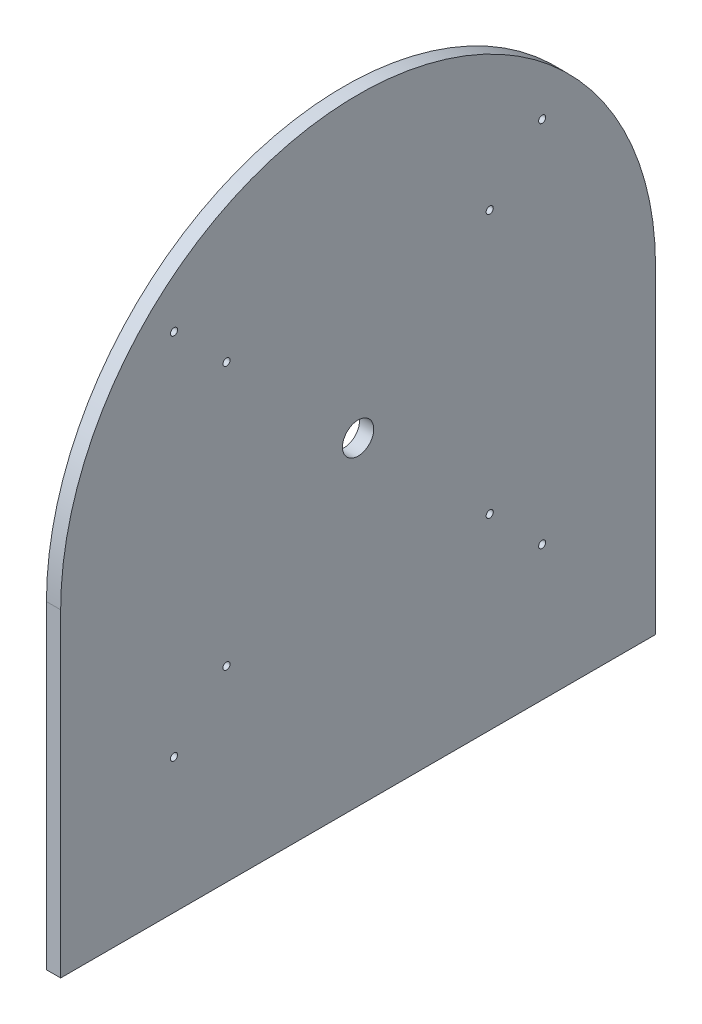
ISO-10303-21;
HEADER;
FILE_DESCRIPTION(('STEP AP214'),'2;1');
FILE_NAME('part.step','',(''),(''),'','','');
FILE_SCHEMA(('AUTOMOTIVE_DESIGN { 1 0 10303 214 1 1 1 1 }'));
ENDSEC;
DATA;
#1=APPLICATION_CONTEXT('core data for automotive mechanical design processes');
#2=APPLICATION_PROTOCOL_DEFINITION('international standard','automotive_design',2000,#1);
#3=PRODUCT_CONTEXT('',#1,'mechanical');
#4=PRODUCT('Part','Part','',(#3));
#5=PRODUCT_RELATED_PRODUCT_CATEGORY('part','',(#4));
#6=PRODUCT_DEFINITION_FORMATION('','',#4);
#7=PRODUCT_DEFINITION_CONTEXT('part definition',#1,'design');
#8=PRODUCT_DEFINITION('design','',#6,#7);
#9=PRODUCT_DEFINITION_SHAPE('','',#8);
#10=(LENGTH_UNIT() NAMED_UNIT(*) SI_UNIT(.MILLI.,.METRE.));
#11=(NAMED_UNIT(*) PLANE_ANGLE_UNIT() SI_UNIT($,.RADIAN.));
#12=(NAMED_UNIT(*) SI_UNIT($,.STERADIAN.) SOLID_ANGLE_UNIT());
#13=UNCERTAINTY_MEASURE_WITH_UNIT(LENGTH_MEASURE(1.E-05),#10,'distance_accuracy_value','');
#14=(GEOMETRIC_REPRESENTATION_CONTEXT(3) GLOBAL_UNCERTAINTY_ASSIGNED_CONTEXT((#13)) GLOBAL_UNIT_ASSIGNED_CONTEXT((#10,
#11,#12)) REPRESENTATION_CONTEXT('',''));
#15=CARTESIAN_POINT('',(0.,0.,0.));
#16=DIRECTION('',(0.,0.,1.));
#17=DIRECTION('',(1.,0.,0.));
#18=AXIS2_PLACEMENT_3D('',#15,#16,#17);
#19=CARTESIAN_POINT('',(10.,0.,0.));
#20=DIRECTION('',(-1.,0.,0.));
#21=DIRECTION('',(0.,0.,1.));
#22=AXIS2_PLACEMENT_3D('',#19,#20,#21);
#23=CYLINDRICAL_SURFACE('',#22,209.31);
#24=CARTESIAN_POINT('',(0.,0.,0.));
#25=DIRECTION('',(1.,0.,0.));
#26=DIRECTION('',(0.,0.,-1.));
#27=AXIS2_PLACEMENT_3D('',#24,#25,#26);
#28=CIRCLE('',#27,209.31);
#29=CARTESIAN_POINT('',(0.,0.,-209.31));
#30=VERTEX_POINT('',#29);
#31=CARTESIAN_POINT('',(0.,0.,209.31));
#32=VERTEX_POINT('',#31);
#33=EDGE_CURVE('E108',#30,#32,#28,.T.);
#34=ORIENTED_EDGE('',*,*,#33,.T.);
#35=DIRECTION('',(-1.,0.,0.));
#36=VECTOR('',#35,1.);
#37=CARTESIAN_POINT('',(10.,0.,209.31));
#38=LINE('',#37,#36);
#39=CARTESIAN_POINT('',(10.,0.,209.31));
#40=VERTEX_POINT('',#39);
#41=EDGE_CURVE('E11',#40,#32,#38,.T.);
#42=ORIENTED_EDGE('',*,*,#41,.F.);
#43=CARTESIAN_POINT('',(10.,0.,0.));
#44=DIRECTION('',(1.,0.,0.));
#45=DIRECTION('',(0.,0.,-1.));
#46=AXIS2_PLACEMENT_3D('',#43,#44,#45);
#47=CIRCLE('',#46,209.31);
#48=CARTESIAN_POINT('',(10.,0.,-209.31));
#49=VERTEX_POINT('',#48);
#50=EDGE_CURVE('E81',#49,#40,#47,.T.);
#51=ORIENTED_EDGE('',*,*,#50,.F.);
#52=DIRECTION('',(-1.,0.,0.));
#53=VECTOR('',#52,1.);
#54=CARTESIAN_POINT('',(10.,0.,-209.31));
#55=LINE('',#54,#53);
#56=EDGE_CURVE('E104',#49,#30,#55,.T.);
#57=ORIENTED_EDGE('',*,*,#56,.T.);
#58=EDGE_LOOP('',(#34,#42,#51,#57));
#59=FACE_BOUND('',#58,.T.);
#60=ADVANCED_FACE('F41',(#59),#23,.T.);
#61=CARTESIAN_POINT('',(10.,0.,209.31));
#62=DIRECTION('',(0.,0.,1.));
#63=DIRECTION('',(0.,-1.,0.));
#64=AXIS2_PLACEMENT_3D('',#61,#62,#63);
#65=PLANE('',#64);
#66=DIRECTION('',(0.,1.,0.));
#67=VECTOR('',#66,1.);
#68=CARTESIAN_POINT('',(0.,0.,209.31));
#69=LINE('',#68,#67);
#70=CARTESIAN_POINT('',(0.,-224.4,209.31));
#71=VERTEX_POINT('',#70);
#72=EDGE_CURVE('E90',#71,#32,#69,.T.);
#73=ORIENTED_EDGE('',*,*,#72,.F.);
#74=DIRECTION('',(-1.,0.,0.));
#75=VECTOR('',#74,1.);
#76=CARTESIAN_POINT('',(10.,-224.4,209.31));
#77=LINE('',#76,#75);
#78=CARTESIAN_POINT('',(10.,-224.4,209.31));
#79=VERTEX_POINT('',#78);
#80=EDGE_CURVE('E50',#79,#71,#77,.T.);
#81=ORIENTED_EDGE('',*,*,#80,.F.);
#82=DIRECTION('',(0.,1.,0.));
#83=VECTOR('',#82,1.);
#84=CARTESIAN_POINT('',(10.,0.,209.31));
#85=LINE('',#84,#83);
#86=EDGE_CURVE('E88',#79,#40,#85,.T.);
#87=ORIENTED_EDGE('',*,*,#86,.T.);
#88=ORIENTED_EDGE('',*,*,#41,.T.);
#89=EDGE_LOOP('',(#73,#81,#87,#88));
#90=FACE_BOUND('',#89,.T.);
#91=ADVANCED_FACE('F87',(#90),#65,.T.);
#92=CARTESIAN_POINT('',(10.,-224.4,0.));
#93=DIRECTION('',(0.,-1.,0.));
#94=DIRECTION('',(0.,0.,-1.));
#95=AXIS2_PLACEMENT_3D('',#92,#93,#94);
#96=PLANE('',#95);
#97=DIRECTION('',(0.,0.,1.));
#98=VECTOR('',#97,1.);
#99=CARTESIAN_POINT('',(0.,-224.4,0.));
#100=LINE('',#99,#98);
#101=CARTESIAN_POINT('',(0.,-224.4,-209.31));
#102=VERTEX_POINT('',#101);
#103=EDGE_CURVE('E115',#102,#71,#100,.T.);
#104=ORIENTED_EDGE('',*,*,#103,.F.);
#105=DIRECTION('',(-1.,0.,0.));
#106=VECTOR('',#105,1.);
#107=CARTESIAN_POINT('',(10.,-224.4,-209.31));
#108=LINE('',#107,#106);
#109=CARTESIAN_POINT('',(10.,-224.4,-209.31));
#110=VERTEX_POINT('',#109);
#111=EDGE_CURVE('E73',#110,#102,#108,.T.);
#112=ORIENTED_EDGE('',*,*,#111,.F.);
#113=DIRECTION('',(0.,0.,1.));
#114=VECTOR('',#113,1.);
#115=CARTESIAN_POINT('',(10.,-224.4,0.));
#116=LINE('',#115,#114);
#117=EDGE_CURVE('E97',#110,#79,#116,.T.);
#118=ORIENTED_EDGE('',*,*,#117,.T.);
#119=ORIENTED_EDGE('',*,*,#80,.T.);
#120=EDGE_LOOP('',(#104,#112,#118,#119));
#121=FACE_BOUND('',#120,.T.);
#122=ADVANCED_FACE('F100',(#121),#96,.T.);
#123=CARTESIAN_POINT('',(10.,0.,-209.31));
#124=DIRECTION('',(0.,0.,1.));
#125=DIRECTION('',(1.,0.,0.));
#126=AXIS2_PLACEMENT_3D('',#123,#124,#125);
#127=PLANE('',#126);
#128=DIRECTION('',(0.,1.,0.));
#129=VECTOR('',#128,1.);
#130=CARTESIAN_POINT('',(0.,0.,-209.31));
#131=LINE('',#130,#129);
#132=EDGE_CURVE('E76',#102,#30,#131,.T.);
#133=ORIENTED_EDGE('',*,*,#132,.T.);
#134=ORIENTED_EDGE('',*,*,#56,.F.);
#135=DIRECTION('',(0.,1.,0.));
#136=VECTOR('',#135,1.);
#137=CARTESIAN_POINT('',(10.,0.,-209.31));
#138=LINE('',#137,#136);
#139=EDGE_CURVE('E58',#110,#49,#138,.T.);
#140=ORIENTED_EDGE('',*,*,#139,.F.);
#141=ORIENTED_EDGE('',*,*,#111,.T.);
#142=EDGE_LOOP('',(#133,#134,#140,#141));
#143=FACE_BOUND('',#142,.T.);
#144=ADVANCED_FACE('F138',(#143),#127,.F.);
#145=CARTESIAN_POINT('',(10.,0.,0.));
#146=DIRECTION('',(1.,0.,0.));
#147=DIRECTION('',(0.,0.,-1.));
#148=AXIS2_PLACEMENT_3D('',#145,#146,#147);
#149=PLANE('',#148);
#150=CARTESIAN_POINT('',(10.,0.,0.));
#151=DIRECTION('',(1.,0.,0.));
#152=DIRECTION('',(0.,0.,-1.));
#153=AXIS2_PLACEMENT_3D('',#150,#151,#152);
#154=CIRCLE('',#153,11.);
#155=CARTESIAN_POINT('',(10.,0.,-11.));
#156=VERTEX_POINT('',#155);
#157=EDGE_CURVE('E328',#156,#156,#154,.T.);
#158=ORIENTED_EDGE('',*,*,#157,.F.);
#159=EDGE_LOOP('',(#158));
#160=FACE_BOUND('',#159,.T.);
#161=CARTESIAN_POINT('',(10.,-92.6097751320016,-92.6097751320129));
#162=DIRECTION('',(1.,0.,0.));
#163=DIRECTION('',(0.,0.,-1.));
#164=AXIS2_PLACEMENT_3D('',#161,#162,#163);
#165=CIRCLE('',#164,2.49999999999715);
#166=CARTESIAN_POINT('',(10.,-92.6097751320016,-95.1097751320101));
#167=VERTEX_POINT('',#166);
#168=EDGE_CURVE('E276',#167,#167,#165,.T.);
#169=ORIENTED_EDGE('',*,*,#168,.F.);
#170=EDGE_LOOP('',(#169));
#171=FACE_BOUND('',#170,.T.);
#172=CARTESIAN_POINT('',(10.,92.6097751320026,-92.6097751320016));
#173=DIRECTION('',(1.,0.,0.));
#174=DIRECTION('',(0.,0.,-1.));
#175=AXIS2_PLACEMENT_3D('',#172,#173,#174);
#176=CIRCLE('',#175,2.5);
#177=CARTESIAN_POINT('',(10.,92.6097751320026,-95.1097751320016));
#178=VERTEX_POINT('',#177);
#179=EDGE_CURVE('E285',#178,#178,#176,.T.);
#180=ORIENTED_EDGE('',*,*,#179,.F.);
#181=EDGE_LOOP('',(#180));
#182=FACE_BOUND('',#181,.T.);
#183=CARTESIAN_POINT('',(10.,129.534891245564,-129.534891245563));
#184=DIRECTION('',(1.,0.,0.));
#185=DIRECTION('',(0.,0.,-1.));
#186=AXIS2_PLACEMENT_3D('',#183,#184,#185);
#187=CIRCLE('',#186,2.5);
#188=CARTESIAN_POINT('',(10.,129.534891245564,-132.034891245563));
#189=VERTEX_POINT('',#188);
#190=EDGE_CURVE('E293',#189,#189,#187,.T.);
#191=ORIENTED_EDGE('',*,*,#190,.F.);
#192=EDGE_LOOP('',(#191));
#193=FACE_BOUND('',#192,.T.);
#194=CARTESIAN_POINT('',(10.,129.534891245553,129.534891245564));
#195=DIRECTION('',(1.,0.,0.));
#196=DIRECTION('',(0.,0.,-1.));
#197=AXIS2_PLACEMENT_3D('',#194,#195,#196);
#198=CIRCLE('',#197,2.50000000001075);
#199=CARTESIAN_POINT('',(10.,129.534891245553,127.034891245554));
#200=VERTEX_POINT('',#199);
#201=EDGE_CURVE('E301',#200,#200,#198,.T.);
#202=ORIENTED_EDGE('',*,*,#201,.F.);
#203=EDGE_LOOP('',(#202));
#204=FACE_BOUND('',#203,.T.);
#205=CARTESIAN_POINT('',(10.,92.6097751319913,92.6097751320027));
#206=DIRECTION('',(1.,0.,0.));
#207=DIRECTION('',(0.,0.,-1.));
#208=AXIS2_PLACEMENT_3D('',#205,#206,#207);
#209=CIRCLE('',#208,2.50000000001048);
#210=CARTESIAN_POINT('',(10.,92.6097751319913,90.1097751319922));
#211=VERTEX_POINT('',#210);
#212=EDGE_CURVE('E309',#211,#211,#209,.T.);
#213=ORIENTED_EDGE('',*,*,#212,.F.);
#214=EDGE_LOOP('',(#213));
#215=FACE_BOUND('',#214,.T.);
#216=CARTESIAN_POINT('',(10.,-129.534891245575,129.534891245553));
#217=DIRECTION('',(1.,0.,0.));
#218=DIRECTION('',(0.,0.,-1.));
#219=AXIS2_PLACEMENT_3D('',#216,#217,#218);
#220=CIRCLE('',#219,2.50000000000739);
#221=CARTESIAN_POINT('',(10.,-129.534891245575,127.034891245545));
#222=VERTEX_POINT('',#221);
#223=EDGE_CURVE('E270',#222,#222,#220,.T.);
#224=ORIENTED_EDGE('',*,*,#223,.F.);
#225=EDGE_LOOP('',(#224));
#226=FACE_BOUND('',#225,.T.);
#227=CARTESIAN_POINT('',(10.,-129.534891245563,-129.534891245575));
#228=DIRECTION('',(1.,0.,0.));
#229=DIRECTION('',(0.,0.,-1.));
#230=AXIS2_PLACEMENT_3D('',#227,#228,#229);
#231=CIRCLE('',#230,2.49999999999725);
#232=CARTESIAN_POINT('',(10.,-129.534891245563,-132.034891245572));
#233=VERTEX_POINT('',#232);
#234=EDGE_CURVE('E262',#233,#233,#231,.T.);
#235=ORIENTED_EDGE('',*,*,#234,.F.);
#236=EDGE_LOOP('',(#235));
#237=FACE_BOUND('',#236,.T.);
#238=CARTESIAN_POINT('',(10.,-92.609775132013,92.6097751319913));
#239=DIRECTION('',(1.,0.,0.));
#240=DIRECTION('',(0.,0.,-1.));
#241=AXIS2_PLACEMENT_3D('',#238,#239,#240);
#242=CIRCLE('',#241,2.5000000000072);
#243=CARTESIAN_POINT('',(10.,-92.609775132013,90.1097751319841));
#244=VERTEX_POINT('',#243);
#245=EDGE_CURVE('E280',#244,#244,#242,.T.);
#246=ORIENTED_EDGE('',*,*,#245,.F.);
#247=EDGE_LOOP('',(#246));
#248=FACE_BOUND('',#247,.T.);
#249=ORIENTED_EDGE('',*,*,#50,.T.);
#250=ORIENTED_EDGE('',*,*,#86,.F.);
#251=ORIENTED_EDGE('',*,*,#117,.F.);
#252=ORIENTED_EDGE('',*,*,#139,.T.);
#253=EDGE_LOOP('',(#249,#250,#251,#252));
#254=FACE_BOUND('',#253,.T.);
#255=ADVANCED_FACE('F96',(#160,#171,#182,#193,#204,#215,#226,#237,#248,#254),#149,.T.);
#256=CARTESIAN_POINT('',(0.,0.,0.));
#257=DIRECTION('',(1.,0.,0.));
#258=DIRECTION('',(0.,0.,-1.));
#259=AXIS2_PLACEMENT_3D('',#256,#257,#258);
#260=PLANE('',#259);
#261=CARTESIAN_POINT('',(0.,0.,0.));
#262=DIRECTION('',(1.,0.,0.));
#263=DIRECTION('',(0.,0.,-1.));
#264=AXIS2_PLACEMENT_3D('',#261,#262,#263);
#265=CIRCLE('',#264,11.);
#266=CARTESIAN_POINT('',(0.,0.,-11.));
#267=VERTEX_POINT('',#266);
#268=EDGE_CURVE('E272',#267,#267,#265,.T.);
#269=ORIENTED_EDGE('',*,*,#268,.T.);
#270=EDGE_LOOP('',(#269));
#271=FACE_BOUND('',#270,.T.);
#272=CARTESIAN_POINT('',(0.,-92.6097751320016,-92.6097751320129));
#273=DIRECTION('',(1.,0.,0.));
#274=DIRECTION('',(0.,0.,-1.));
#275=AXIS2_PLACEMENT_3D('',#272,#273,#274);
#276=CIRCLE('',#275,2.49999999999715);
#277=CARTESIAN_POINT('',(0.,-92.6097751320016,-95.1097751320101));
#278=VERTEX_POINT('',#277);
#279=EDGE_CURVE('E281',#278,#278,#276,.T.);
#280=ORIENTED_EDGE('',*,*,#279,.T.);
#281=EDGE_LOOP('',(#280));
#282=FACE_BOUND('',#281,.T.);
#283=CARTESIAN_POINT('',(0.,92.6097751320026,-92.6097751320016));
#284=DIRECTION('',(1.,0.,0.));
#285=DIRECTION('',(0.,0.,-1.));
#286=AXIS2_PLACEMENT_3D('',#283,#284,#285);
#287=CIRCLE('',#286,2.5);
#288=CARTESIAN_POINT('',(0.,92.6097751320026,-95.1097751320016));
#289=VERTEX_POINT('',#288);
#290=EDGE_CURVE('E289',#289,#289,#287,.T.);
#291=ORIENTED_EDGE('',*,*,#290,.T.);
#292=EDGE_LOOP('',(#291));
#293=FACE_BOUND('',#292,.T.);
#294=CARTESIAN_POINT('',(0.,129.534891245564,-129.534891245563));
#295=DIRECTION('',(1.,0.,0.));
#296=DIRECTION('',(0.,0.,-1.));
#297=AXIS2_PLACEMENT_3D('',#294,#295,#296);
#298=CIRCLE('',#297,2.5);
#299=CARTESIAN_POINT('',(0.,129.534891245564,-132.034891245563));
#300=VERTEX_POINT('',#299);
#301=EDGE_CURVE('E297',#300,#300,#298,.T.);
#302=ORIENTED_EDGE('',*,*,#301,.T.);
#303=EDGE_LOOP('',(#302));
#304=FACE_BOUND('',#303,.T.);
#305=CARTESIAN_POINT('',(0.,129.534891245553,129.534891245564));
#306=DIRECTION('',(1.,0.,0.));
#307=DIRECTION('',(0.,0.,-1.));
#308=AXIS2_PLACEMENT_3D('',#305,#306,#307);
#309=CIRCLE('',#308,2.50000000001075);
#310=CARTESIAN_POINT('',(0.,129.534891245553,127.034891245554));
#311=VERTEX_POINT('',#310);
#312=EDGE_CURVE('E305',#311,#311,#309,.T.);
#313=ORIENTED_EDGE('',*,*,#312,.T.);
#314=EDGE_LOOP('',(#313));
#315=FACE_BOUND('',#314,.T.);
#316=CARTESIAN_POINT('',(0.,92.6097751319913,92.6097751320027));
#317=DIRECTION('',(1.,0.,0.));
#318=DIRECTION('',(0.,0.,-1.));
#319=AXIS2_PLACEMENT_3D('',#316,#317,#318);
#320=CIRCLE('',#319,2.50000000001048);
#321=CARTESIAN_POINT('',(0.,92.6097751319913,90.1097751319922));
#322=VERTEX_POINT('',#321);
#323=EDGE_CURVE('E319',#322,#322,#320,.T.);
#324=ORIENTED_EDGE('',*,*,#323,.T.);
#325=EDGE_LOOP('',(#324));
#326=FACE_BOUND('',#325,.T.);
#327=CARTESIAN_POINT('',(0.,-129.534891245575,129.534891245553));
#328=DIRECTION('',(1.,0.,0.));
#329=DIRECTION('',(0.,0.,-1.));
#330=AXIS2_PLACEMENT_3D('',#327,#328,#329);
#331=CIRCLE('',#330,2.50000000000739);
#332=CARTESIAN_POINT('',(0.,-129.534891245575,127.034891245545));
#333=VERTEX_POINT('',#332);
#334=EDGE_CURVE('E265',#333,#333,#331,.T.);
#335=ORIENTED_EDGE('',*,*,#334,.T.);
#336=EDGE_LOOP('',(#335));
#337=FACE_BOUND('',#336,.T.);
#338=CARTESIAN_POINT('',(0.,-129.534891245563,-129.534891245575));
#339=DIRECTION('',(1.,0.,0.));
#340=DIRECTION('',(0.,0.,-1.));
#341=AXIS2_PLACEMENT_3D('',#338,#339,#340);
#342=CIRCLE('',#341,2.49999999999725);
#343=CARTESIAN_POINT('',(0.,-129.534891245563,-132.034891245572));
#344=VERTEX_POINT('',#343);
#345=EDGE_CURVE('E259',#344,#344,#342,.T.);
#346=ORIENTED_EDGE('',*,*,#345,.T.);
#347=EDGE_LOOP('',(#346));
#348=FACE_BOUND('',#347,.T.);
#349=CARTESIAN_POINT('',(0.,-92.609775132013,92.6097751319913));
#350=DIRECTION('',(1.,0.,0.));
#351=DIRECTION('',(0.,0.,-1.));
#352=AXIS2_PLACEMENT_3D('',#349,#350,#351);
#353=CIRCLE('',#352,2.5000000000072);
#354=CARTESIAN_POINT('',(0.,-92.609775132013,90.1097751319841));
#355=VERTEX_POINT('',#354);
#356=EDGE_CURVE('E112',#355,#355,#353,.T.);
#357=ORIENTED_EDGE('',*,*,#356,.T.);
#358=EDGE_LOOP('',(#357));
#359=FACE_BOUND('',#358,.T.);
#360=ORIENTED_EDGE('',*,*,#33,.F.);
#361=ORIENTED_EDGE('',*,*,#132,.F.);
#362=ORIENTED_EDGE('',*,*,#103,.T.);
#363=ORIENTED_EDGE('',*,*,#72,.T.);
#364=EDGE_LOOP('',(#360,#361,#362,#363));
#365=FACE_BOUND('',#364,.T.);
#366=ADVANCED_FACE('F126',(#271,#282,#293,#304,#315,#326,#337,#348,#359,#365),#260,.F.);
#367=CARTESIAN_POINT('',(0.,-92.609775132013,92.6097751319913));
#368=DIRECTION('',(1.,0.,0.));
#369=DIRECTION('',(0.,0.,-1.));
#370=AXIS2_PLACEMENT_3D('',#367,#368,#369);
#371=CYLINDRICAL_SURFACE('',#370,2.5000000000072);
#372=ORIENTED_EDGE('',*,*,#356,.F.);
#373=EDGE_LOOP('',(#372));
#374=FACE_BOUND('',#373,.T.);
#375=ORIENTED_EDGE('',*,*,#245,.T.);
#376=EDGE_LOOP('',(#375));
#377=FACE_BOUND('',#376,.T.);
#378=ADVANCED_FACE('F128',(#374,#377),#371,.F.);
#379=CARTESIAN_POINT('',(0.,-129.534891245563,-129.534891245575));
#380=DIRECTION('',(1.,0.,0.));
#381=DIRECTION('',(0.,0.,-1.));
#382=AXIS2_PLACEMENT_3D('',#379,#380,#381);
#383=CYLINDRICAL_SURFACE('',#382,2.49999999999725);
#384=ORIENTED_EDGE('',*,*,#345,.F.);
#385=EDGE_LOOP('',(#384));
#386=FACE_BOUND('',#385,.T.);
#387=ORIENTED_EDGE('',*,*,#234,.T.);
#388=EDGE_LOOP('',(#387));
#389=FACE_BOUND('',#388,.T.);
#390=ADVANCED_FACE('F135',(#386,#389),#383,.F.);
#391=CARTESIAN_POINT('',(0.,-129.534891245575,129.534891245553));
#392=DIRECTION('',(1.,0.,0.));
#393=DIRECTION('',(0.,0.,-1.));
#394=AXIS2_PLACEMENT_3D('',#391,#392,#393);
#395=CYLINDRICAL_SURFACE('',#394,2.50000000000739);
#396=ORIENTED_EDGE('',*,*,#334,.F.);
#397=EDGE_LOOP('',(#396));
#398=FACE_BOUND('',#397,.T.);
#399=ORIENTED_EDGE('',*,*,#223,.T.);
#400=EDGE_LOOP('',(#399));
#401=FACE_BOUND('',#400,.T.);
#402=ADVANCED_FACE('F220',(#398,#401),#395,.F.);
#403=CARTESIAN_POINT('',(0.,92.6097751319913,92.6097751320027));
#404=DIRECTION('',(1.,0.,0.));
#405=DIRECTION('',(0.,0.,-1.));
#406=AXIS2_PLACEMENT_3D('',#403,#404,#405);
#407=CYLINDRICAL_SURFACE('',#406,2.50000000001048);
#408=ORIENTED_EDGE('',*,*,#323,.F.);
#409=EDGE_LOOP('',(#408));
#410=FACE_BOUND('',#409,.T.);
#411=ORIENTED_EDGE('',*,*,#212,.T.);
#412=EDGE_LOOP('',(#411));
#413=FACE_BOUND('',#412,.T.);
#414=ADVANCED_FACE('F212',(#410,#413),#407,.F.);
#415=CARTESIAN_POINT('',(0.,129.534891245553,129.534891245564));
#416=DIRECTION('',(1.,0.,0.));
#417=DIRECTION('',(0.,0.,-1.));
#418=AXIS2_PLACEMENT_3D('',#415,#416,#417);
#419=CYLINDRICAL_SURFACE('',#418,2.50000000001075);
#420=ORIENTED_EDGE('',*,*,#312,.F.);
#421=EDGE_LOOP('',(#420));
#422=FACE_BOUND('',#421,.T.);
#423=ORIENTED_EDGE('',*,*,#201,.T.);
#424=EDGE_LOOP('',(#423));
#425=FACE_BOUND('',#424,.T.);
#426=ADVANCED_FACE('F204',(#422,#425),#419,.F.);
#427=CARTESIAN_POINT('',(0.,129.534891245564,-129.534891245563));
#428=DIRECTION('',(1.,0.,0.));
#429=DIRECTION('',(0.,0.,-1.));
#430=AXIS2_PLACEMENT_3D('',#427,#428,#429);
#431=CYLINDRICAL_SURFACE('',#430,2.5);
#432=ORIENTED_EDGE('',*,*,#301,.F.);
#433=EDGE_LOOP('',(#432));
#434=FACE_BOUND('',#433,.T.);
#435=ORIENTED_EDGE('',*,*,#190,.T.);
#436=EDGE_LOOP('',(#435));
#437=FACE_BOUND('',#436,.T.);
#438=ADVANCED_FACE('F196',(#434,#437),#431,.F.);
#439=CARTESIAN_POINT('',(0.,92.6097751320026,-92.6097751320016));
#440=DIRECTION('',(1.,0.,0.));
#441=DIRECTION('',(0.,0.,-1.));
#442=AXIS2_PLACEMENT_3D('',#439,#440,#441);
#443=CYLINDRICAL_SURFACE('',#442,2.5);
#444=ORIENTED_EDGE('',*,*,#290,.F.);
#445=EDGE_LOOP('',(#444));
#446=FACE_BOUND('',#445,.T.);
#447=ORIENTED_EDGE('',*,*,#179,.T.);
#448=EDGE_LOOP('',(#447));
#449=FACE_BOUND('',#448,.T.);
#450=ADVANCED_FACE('F191',(#446,#449),#443,.F.);
#451=CARTESIAN_POINT('',(0.,-92.6097751320016,-92.6097751320129));
#452=DIRECTION('',(1.,0.,0.));
#453=DIRECTION('',(0.,0.,-1.));
#454=AXIS2_PLACEMENT_3D('',#451,#452,#453);
#455=CYLINDRICAL_SURFACE('',#454,2.49999999999715);
#456=ORIENTED_EDGE('',*,*,#279,.F.);
#457=EDGE_LOOP('',(#456));
#458=FACE_BOUND('',#457,.T.);
#459=ORIENTED_EDGE('',*,*,#168,.T.);
#460=EDGE_LOOP('',(#459));
#461=FACE_BOUND('',#460,.T.);
#462=ADVANCED_FACE('F169',(#458,#461),#455,.F.);
#463=CARTESIAN_POINT('',(0.,0.,0.));
#464=DIRECTION('',(1.,0.,0.));
#465=DIRECTION('',(0.,0.,-1.));
#466=AXIS2_PLACEMENT_3D('',#463,#464,#465);
#467=CYLINDRICAL_SURFACE('',#466,11.);
#468=ORIENTED_EDGE('',*,*,#268,.F.);
#469=EDGE_LOOP('',(#468));
#470=FACE_BOUND('',#469,.T.);
#471=ORIENTED_EDGE('',*,*,#157,.T.);
#472=EDGE_LOOP('',(#471));
#473=FACE_BOUND('',#472,.T.);
#474=ADVANCED_FACE('F180',(#470,#473),#467,.F.);
#475=CLOSED_SHELL('',(#60,#91,#122,#144,#255,#366,#378,#390,#402,#414,#426,#438,#450,#462,#474));
#476=MANIFOLD_SOLID_BREP('B2',#475);
#477=ADVANCED_BREP_SHAPE_REPRESENTATION('',(#18,#476),#14);
#478=SHAPE_DEFINITION_REPRESENTATION(#9,#477);
ENDSEC;
END-ISO-10303-21;
